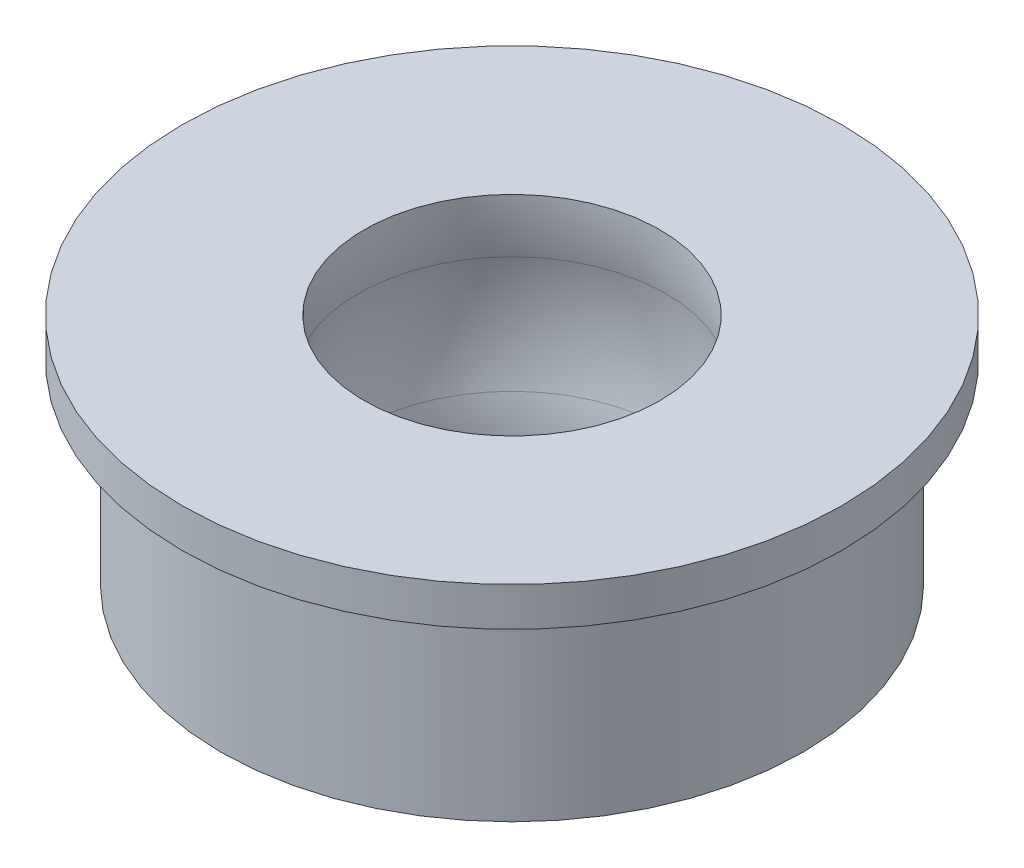
ISO-10303-21;
HEADER;
FILE_DESCRIPTION(('STEP AP214'),'2;1');
FILE_NAME('part.step','',(''),(''),'','','');
FILE_SCHEMA(('AUTOMOTIVE_DESIGN { 1 0 10303 214 1 1 1 1 }'));
ENDSEC;
DATA;
#1=APPLICATION_CONTEXT('core data for automotive mechanical design processes');
#2=APPLICATION_PROTOCOL_DEFINITION('international standard','automotive_design',2000,#1);
#3=PRODUCT_CONTEXT('',#1,'mechanical');
#4=PRODUCT('Part','Part','',(#3));
#5=PRODUCT_RELATED_PRODUCT_CATEGORY('part','',(#4));
#6=PRODUCT_DEFINITION_FORMATION('','',#4);
#7=PRODUCT_DEFINITION_CONTEXT('part definition',#1,'design');
#8=PRODUCT_DEFINITION('design','',#6,#7);
#9=PRODUCT_DEFINITION_SHAPE('','',#8);
#10=(LENGTH_UNIT() NAMED_UNIT(*) SI_UNIT(.MILLI.,.METRE.));
#11=(NAMED_UNIT(*) PLANE_ANGLE_UNIT() SI_UNIT($,.RADIAN.));
#12=(NAMED_UNIT(*) SI_UNIT($,.STERADIAN.) SOLID_ANGLE_UNIT());
#13=UNCERTAINTY_MEASURE_WITH_UNIT(LENGTH_MEASURE(1.E-05),#10,'distance_accuracy_value','');
#14=(GEOMETRIC_REPRESENTATION_CONTEXT(3) GLOBAL_UNCERTAINTY_ASSIGNED_CONTEXT((#13)) GLOBAL_UNIT_ASSIGNED_CONTEXT((#10,
#11,#12)) REPRESENTATION_CONTEXT('',''));
#15=CARTESIAN_POINT('',(0.,0.,0.));
#16=DIRECTION('',(0.,0.,1.));
#17=DIRECTION('',(1.,0.,0.));
#18=AXIS2_PLACEMENT_3D('',#15,#16,#17);
#19=CARTESIAN_POINT('',(0.,0.,0.));
#20=DIRECTION('',(0.,1.,0.));
#21=DIRECTION('',(0.,0.,1.));
#22=AXIS2_PLACEMENT_3D('',#19,#20,#21);
#23=PLANE('',#22);
#24=CARTESIAN_POINT('',(0.,0.,0.));
#25=DIRECTION('',(0.,1.,0.));
#26=DIRECTION('',(0.,0.,1.));
#27=AXIS2_PLACEMENT_3D('',#24,#25,#26);
#28=CIRCLE('',#27,6.);
#29=CARTESIAN_POINT('',(0.,0.,6.));
#30=VERTEX_POINT('',#29);
#31=EDGE_CURVE('E41',#30,#30,#28,.T.);
#32=ORIENTED_EDGE('',*,*,#31,.F.);
#33=EDGE_LOOP('',(#32));
#34=FACE_BOUND('',#33,.T.);
#35=CARTESIAN_POINT('',(0.,0.,0.));
#36=DIRECTION('',(0.,-1.,0.));
#37=DIRECTION('',(1.,0.,0.));
#38=AXIS2_PLACEMENT_3D('',#35,#36,#37);
#39=CIRCLE('',#38,3.04999999999999);
#40=CARTESIAN_POINT('',(3.04999999999999,0.,0.));
#41=VERTEX_POINT('',#40);
#42=EDGE_CURVE('E61',#41,#41,#39,.T.);
#43=ORIENTED_EDGE('',*,*,#42,.F.);
#44=EDGE_LOOP('',(#43));
#45=FACE_BOUND('',#44,.T.);
#46=ADVANCED_FACE('F37',(#34,#45),#23,.F.);
#47=CARTESIAN_POINT('',(0.,4.,0.));
#48=DIRECTION('',(0.,-1.,0.));
#49=DIRECTION('',(0.,0.,-1.));
#50=AXIS2_PLACEMENT_3D('',#47,#48,#49);
#51=CYLINDRICAL_SURFACE('',#50,6.);
#52=CARTESIAN_POINT('',(0.,4.,0.));
#53=DIRECTION('',(0.,1.,0.));
#54=DIRECTION('',(0.,0.,1.));
#55=AXIS2_PLACEMENT_3D('',#52,#53,#54);
#56=CIRCLE('',#55,6.);
#57=CARTESIAN_POINT('',(0.,4.,6.));
#58=VERTEX_POINT('',#57);
#59=EDGE_CURVE('E10',#58,#58,#56,.T.);
#60=ORIENTED_EDGE('',*,*,#59,.F.);
#61=EDGE_LOOP('',(#60));
#62=FACE_BOUND('',#61,.T.);
#63=ORIENTED_EDGE('',*,*,#31,.T.);
#64=EDGE_LOOP('',(#63));
#65=FACE_BOUND('',#64,.T.);
#66=ADVANCED_FACE('F39',(#62,#65),#51,.T.);
#67=CARTESIAN_POINT('',(0.,4.8,0.));
#68=DIRECTION('',(0.,1.,0.));
#69=DIRECTION('',(0.,0.,1.));
#70=AXIS2_PLACEMENT_3D('',#67,#68,#69);
#71=PLANE('',#70);
#72=CARTESIAN_POINT('',(0.,4.8,0.));
#73=DIRECTION('',(0.,1.,0.));
#74=DIRECTION('',(0.,0.,1.));
#75=AXIS2_PLACEMENT_3D('',#72,#73,#74);
#76=CIRCLE('',#75,6.8);
#77=CARTESIAN_POINT('',(0.,4.8,6.8));
#78=VERTEX_POINT('',#77);
#79=EDGE_CURVE('E48',#78,#78,#76,.T.);
#80=ORIENTED_EDGE('',*,*,#79,.T.);
#81=EDGE_LOOP('',(#80));
#82=FACE_BOUND('',#81,.T.);
#83=CARTESIAN_POINT('',(0.,4.8,0.));
#84=DIRECTION('',(0.,-1.,0.));
#85=DIRECTION('',(1.,0.,0.));
#86=AXIS2_PLACEMENT_3D('',#83,#84,#85);
#87=CIRCLE('',#86,3.05);
#88=CARTESIAN_POINT('',(3.05,4.8,0.));
#89=VERTEX_POINT('',#88);
#90=EDGE_CURVE('E64',#89,#89,#87,.T.);
#91=ORIENTED_EDGE('',*,*,#90,.T.);
#92=EDGE_LOOP('',(#91));
#93=FACE_BOUND('',#92,.T.);
#94=ADVANCED_FACE('F68',(#82,#93),#71,.T.);
#95=CARTESIAN_POINT('',(0.,4.,0.));
#96=DIRECTION('',(0.,1.,0.));
#97=DIRECTION('',(0.,0.,1.));
#98=AXIS2_PLACEMENT_3D('',#95,#96,#97);
#99=PLANE('',#98);
#100=ORIENTED_EDGE('',*,*,#59,.T.);
#101=EDGE_LOOP('',(#100));
#102=FACE_BOUND('',#101,.T.);
#103=CARTESIAN_POINT('',(0.,4.,0.));
#104=DIRECTION('',(0.,1.,0.));
#105=DIRECTION('',(0.,0.,1.));
#106=AXIS2_PLACEMENT_3D('',#103,#104,#105);
#107=CIRCLE('',#106,6.8);
#108=CARTESIAN_POINT('',(0.,4.,6.8));
#109=VERTEX_POINT('',#108);
#110=EDGE_CURVE('E50',#109,#109,#107,.T.);
#111=ORIENTED_EDGE('',*,*,#110,.F.);
#112=EDGE_LOOP('',(#111));
#113=FACE_BOUND('',#112,.T.);
#114=ADVANCED_FACE('F83',(#102,#113),#99,.F.);
#115=CARTESIAN_POINT('',(0.,4.8,0.));
#116=DIRECTION('',(0.,-1.,0.));
#117=DIRECTION('',(0.,0.,-1.));
#118=AXIS2_PLACEMENT_3D('',#115,#116,#117);
#119=CYLINDRICAL_SURFACE('',#118,6.8);
#120=ORIENTED_EDGE('',*,*,#79,.F.);
#121=EDGE_LOOP('',(#120));
#122=FACE_BOUND('',#121,.T.);
#123=ORIENTED_EDGE('',*,*,#110,.T.);
#124=EDGE_LOOP('',(#123));
#125=FACE_BOUND('',#124,.T.);
#126=ADVANCED_FACE('F73',(#122,#125),#119,.T.);
#127=CARTESIAN_POINT('',(0.,4.8,0.));
#128=DIRECTION('',(0.,-1.,0.));
#129=DIRECTION('',(1.,0.,0.));
#130=AXIS2_PLACEMENT_3D('',#127,#128,#129);
#131=TOROIDAL_SURFACE('',#130,9.05999999999961,6.00999999999962);
#132=CARTESIAN_POINT('',(0.,3.6,0.));
#133=DIRECTION('',(0.,-1.,0.));
#134=DIRECTION('',(1.,0.,0.));
#135=AXIS2_PLACEMENT_3D('',#132,#133,#134);
#136=CIRCLE('',#135,3.1710187638268);
#137=CARTESIAN_POINT('',(3.1710187638268,3.6,0.));
#138=VERTEX_POINT('',#137);
#139=EDGE_CURVE('E53',#138,#138,#136,.T.);
#140=ORIENTED_EDGE('',*,*,#139,.T.);
#141=EDGE_LOOP('',(#140));
#142=FACE_BOUND('',#141,.T.);
#143=ORIENTED_EDGE('',*,*,#90,.F.);
#144=EDGE_LOOP('',(#143));
#145=FACE_BOUND('',#144,.T.);
#146=ADVANCED_FACE('F70',(#142,#145),#131,.T.);
#147=CARTESIAN_POINT('',(0.,2.4,0.));
#148=DIRECTION('',(0.,-1.,0.));
#149=DIRECTION('',(1.,0.,0.));
#150=AXIS2_PLACEMENT_3D('',#147,#148,#149);
#151=DEGENERATE_TOROIDAL_SURFACE('',#150,2.71796247234602,6.00999999999962,.F.);
#152=CARTESIAN_POINT('',(0.,1.2,0.));
#153=DIRECTION('',(0.,-1.,0.));
#154=DIRECTION('',(1.,0.,0.));
#155=AXIS2_PLACEMENT_3D('',#152,#153,#154);
#156=CIRCLE('',#155,3.1710187638268);
#157=CARTESIAN_POINT('',(3.1710187638268,1.2,0.));
#158=VERTEX_POINT('',#157);
#159=EDGE_CURVE('E58',#158,#158,#156,.T.);
#160=ORIENTED_EDGE('',*,*,#159,.T.);
#161=EDGE_LOOP('',(#160));
#162=FACE_BOUND('',#161,.T.);
#163=ORIENTED_EDGE('',*,*,#139,.F.);
#164=EDGE_LOOP('',(#163));
#165=FACE_BOUND('',#164,.T.);
#166=ADVANCED_FACE('F72',(#162,#165),#151,.T.);
#167=CARTESIAN_POINT('',(0.,0.,0.));
#168=DIRECTION('',(0.,-1.,0.));
#169=DIRECTION('',(1.,0.,0.));
#170=AXIS2_PLACEMENT_3D('',#167,#168,#169);
#171=TOROIDAL_SURFACE('',#170,9.05999999999961,6.00999999999962);
#172=ORIENTED_EDGE('',*,*,#42,.T.);
#173=EDGE_LOOP('',(#172));
#174=FACE_BOUND('',#173,.T.);
#175=ORIENTED_EDGE('',*,*,#159,.F.);
#176=EDGE_LOOP('',(#175));
#177=FACE_BOUND('',#176,.T.);
#178=ADVANCED_FACE('F80',(#174,#177),#171,.T.);
#179=CLOSED_SHELL('',(#46,#66,#94,#114,#126,#146,#166,#178));
#180=MANIFOLD_SOLID_BREP('B2',#179);
#181=ADVANCED_BREP_SHAPE_REPRESENTATION('',(#18,#180),#14);
#182=SHAPE_DEFINITION_REPRESENTATION(#9,#181);
ENDSEC;
END-ISO-10303-21;
